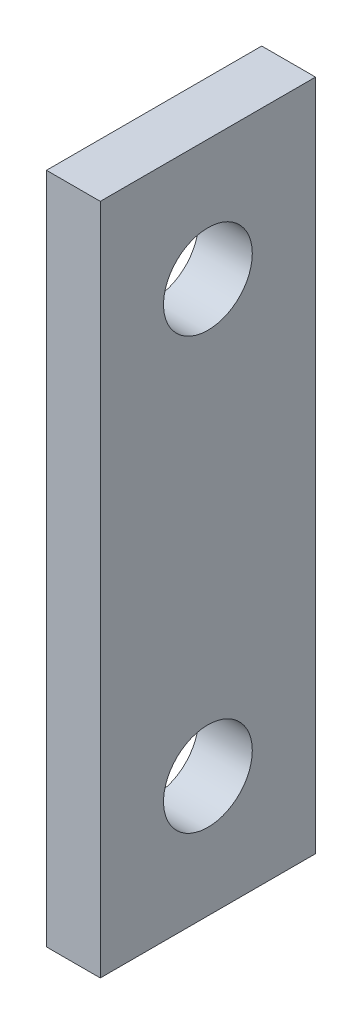
ISO-10303-21;
HEADER;
FILE_DESCRIPTION(('STEP AP214'),'2;1');
FILE_NAME('part.step','',(''),(''),'','','');
FILE_SCHEMA(('AUTOMOTIVE_DESIGN { 1 0 10303 214 1 1 1 1 }'));
ENDSEC;
DATA;
#1=APPLICATION_CONTEXT('core data for automotive mechanical design processes');
#2=APPLICATION_PROTOCOL_DEFINITION('international standard','automotive_design',2000,#1);
#3=PRODUCT_CONTEXT('',#1,'mechanical');
#4=PRODUCT('Part','Part','',(#3));
#5=PRODUCT_RELATED_PRODUCT_CATEGORY('part','',(#4));
#6=PRODUCT_DEFINITION_FORMATION('','',#4);
#7=PRODUCT_DEFINITION_CONTEXT('part definition',#1,'design');
#8=PRODUCT_DEFINITION('design','',#6,#7);
#9=PRODUCT_DEFINITION_SHAPE('','',#8);
#10=(LENGTH_UNIT() NAMED_UNIT(*) SI_UNIT(.MILLI.,.METRE.));
#11=(NAMED_UNIT(*) PLANE_ANGLE_UNIT() SI_UNIT($,.RADIAN.));
#12=(NAMED_UNIT(*) SI_UNIT($,.STERADIAN.) SOLID_ANGLE_UNIT());
#13=UNCERTAINTY_MEASURE_WITH_UNIT(LENGTH_MEASURE(1.E-05),#10,'distance_accuracy_value','');
#14=(GEOMETRIC_REPRESENTATION_CONTEXT(3) GLOBAL_UNCERTAINTY_ASSIGNED_CONTEXT((#13)) GLOBAL_UNIT_ASSIGNED_CONTEXT((#10,
#11,#12)) REPRESENTATION_CONTEXT('',''));
#15=CARTESIAN_POINT('',(0.,0.,0.));
#16=DIRECTION('',(0.,0.,1.));
#17=DIRECTION('',(1.,0.,0.));
#18=AXIS2_PLACEMENT_3D('',#15,#16,#17);
#19=CARTESIAN_POINT('',(5.,0.,0.));
#20=DIRECTION('',(1.,0.,0.));
#21=DIRECTION('',(0.,0.,-1.));
#22=AXIS2_PLACEMENT_3D('',#19,#20,#21);
#23=PLANE('',#22);
#24=CARTESIAN_POINT('',(5.,-40.,0.));
#25=DIRECTION('',(1.,0.,0.));
#26=DIRECTION('',(0.,0.,-1.));
#27=AXIS2_PLACEMENT_3D('',#24,#25,#26);
#28=CIRCLE('',#27,8.25);
#29=CARTESIAN_POINT('',(5.,-40.,-8.25));
#30=VERTEX_POINT('',#29);
#31=EDGE_CURVE('E106',#30,#30,#28,.T.);
#32=ORIENTED_EDGE('',*,*,#31,.F.);
#33=EDGE_LOOP('',(#32));
#34=FACE_BOUND('',#33,.T.);
#35=DIRECTION('',(0.,0.,1.));
#36=VECTOR('',#35,1.);
#37=CARTESIAN_POINT('',(5.,62.5,20.));
#38=LINE('',#37,#36);
#39=CARTESIAN_POINT('',(5.,62.5,-20.));
#40=VERTEX_POINT('',#39);
#41=CARTESIAN_POINT('',(5.,62.5,20.));
#42=VERTEX_POINT('',#41);
#43=EDGE_CURVE('E91',#40,#42,#38,.T.);
#44=ORIENTED_EDGE('',*,*,#43,.T.);
#45=DIRECTION('',(0.,-1.,0.));
#46=VECTOR('',#45,1.);
#47=CARTESIAN_POINT('',(5.,-62.5,20.));
#48=LINE('',#47,#46);
#49=CARTESIAN_POINT('',(5.,-62.5,20.));
#50=VERTEX_POINT('',#49);
#51=EDGE_CURVE('E86',#42,#50,#48,.T.);
#52=ORIENTED_EDGE('',*,*,#51,.T.);
#53=DIRECTION('',(0.,0.,-1.));
#54=VECTOR('',#53,1.);
#55=CARTESIAN_POINT('',(5.,-62.5,20.));
#56=LINE('',#55,#54);
#57=CARTESIAN_POINT('',(5.,-62.5,-20.));
#58=VERTEX_POINT('',#57);
#59=EDGE_CURVE('E89',#50,#58,#56,.T.);
#60=ORIENTED_EDGE('',*,*,#59,.T.);
#61=DIRECTION('',(0.,1.,0.));
#62=VECTOR('',#61,1.);
#63=CARTESIAN_POINT('',(5.,-62.5,-20.));
#64=LINE('',#63,#62);
#65=EDGE_CURVE('E56',#58,#40,#64,.T.);
#66=ORIENTED_EDGE('',*,*,#65,.T.);
#67=EDGE_LOOP('',(#44,#52,#60,#66));
#68=FACE_BOUND('',#67,.T.);
#69=CARTESIAN_POINT('',(5.,40.,0.));
#70=DIRECTION('',(1.,0.,0.));
#71=DIRECTION('',(0.,0.,-1.));
#72=AXIS2_PLACEMENT_3D('',#69,#70,#71);
#73=CIRCLE('',#72,8.25);
#74=CARTESIAN_POINT('',(5.,40.,-8.25));
#75=VERTEX_POINT('',#74);
#76=EDGE_CURVE('E121',#75,#75,#73,.T.);
#77=ORIENTED_EDGE('',*,*,#76,.F.);
#78=EDGE_LOOP('',(#77));
#79=FACE_BOUND('',#78,.T.);
#80=ADVANCED_FACE('F39',(#34,#68,#79),#23,.T.);
#81=CARTESIAN_POINT('',(-5.,0.,0.));
#82=DIRECTION('',(1.,0.,0.));
#83=DIRECTION('',(0.,0.,-1.));
#84=AXIS2_PLACEMENT_3D('',#81,#82,#83);
#85=PLANE('',#84);
#86=DIRECTION('',(0.,0.,1.));
#87=VECTOR('',#86,1.);
#88=CARTESIAN_POINT('',(-5.,62.5,20.));
#89=LINE('',#88,#87);
#90=CARTESIAN_POINT('',(-5.,62.5,-20.));
#91=VERTEX_POINT('',#90);
#92=CARTESIAN_POINT('',(-5.,62.5,20.));
#93=VERTEX_POINT('',#92);
#94=EDGE_CURVE('E103',#91,#93,#89,.T.);
#95=ORIENTED_EDGE('',*,*,#94,.F.);
#96=DIRECTION('',(0.,1.,0.));
#97=VECTOR('',#96,1.);
#98=CARTESIAN_POINT('',(-5.,-62.5,-20.));
#99=LINE('',#98,#97);
#100=CARTESIAN_POINT('',(-5.,-62.5,-20.));
#101=VERTEX_POINT('',#100);
#102=EDGE_CURVE('E79',#101,#91,#99,.T.);
#103=ORIENTED_EDGE('',*,*,#102,.F.);
#104=DIRECTION('',(0.,0.,-1.));
#105=VECTOR('',#104,1.);
#106=CARTESIAN_POINT('',(-5.,-62.5,20.));
#107=LINE('',#106,#105);
#108=CARTESIAN_POINT('',(-5.,-62.5,20.));
#109=VERTEX_POINT('',#108);
#110=EDGE_CURVE('E73',#109,#101,#107,.T.);
#111=ORIENTED_EDGE('',*,*,#110,.F.);
#112=DIRECTION('',(0.,-1.,0.));
#113=VECTOR('',#112,1.);
#114=CARTESIAN_POINT('',(-5.,-62.5,20.));
#115=LINE('',#114,#113);
#116=EDGE_CURVE('E95',#93,#109,#115,.T.);
#117=ORIENTED_EDGE('',*,*,#116,.F.);
#118=EDGE_LOOP('',(#95,#103,#111,#117));
#119=FACE_BOUND('',#118,.T.);
#120=CARTESIAN_POINT('',(-5.,-40.,0.));
#121=DIRECTION('',(1.,0.,0.));
#122=DIRECTION('',(0.,0.,-1.));
#123=AXIS2_PLACEMENT_3D('',#120,#121,#122);
#124=CIRCLE('',#123,8.25);
#125=CARTESIAN_POINT('',(-5.,-40.,-8.25));
#126=VERTEX_POINT('',#125);
#127=EDGE_CURVE('E118',#126,#126,#124,.T.);
#128=ORIENTED_EDGE('',*,*,#127,.T.);
#129=EDGE_LOOP('',(#128));
#130=FACE_BOUND('',#129,.T.);
#131=CARTESIAN_POINT('',(-5.,40.,0.));
#132=DIRECTION('',(1.,0.,0.));
#133=DIRECTION('',(0.,0.,-1.));
#134=AXIS2_PLACEMENT_3D('',#131,#132,#133);
#135=CIRCLE('',#134,8.25);
#136=CARTESIAN_POINT('',(-5.,40.,-8.25));
#137=VERTEX_POINT('',#136);
#138=EDGE_CURVE('E124',#137,#137,#135,.T.);
#139=ORIENTED_EDGE('',*,*,#138,.T.);
#140=EDGE_LOOP('',(#139));
#141=FACE_BOUND('',#140,.T.);
#142=ADVANCED_FACE('F114',(#119,#130,#141),#85,.F.);
#143=CARTESIAN_POINT('',(5.,62.5,20.));
#144=DIRECTION('',(0.,-1.,0.));
#145=DIRECTION('',(0.,0.,-1.));
#146=AXIS2_PLACEMENT_3D('',#143,#144,#145);
#147=PLANE('',#146);
#148=ORIENTED_EDGE('',*,*,#94,.T.);
#149=DIRECTION('',(-1.,0.,0.));
#150=VECTOR('',#149,1.);
#151=CARTESIAN_POINT('',(5.,62.5,20.));
#152=LINE('',#151,#150);
#153=EDGE_CURVE('E11',#42,#93,#152,.T.);
#154=ORIENTED_EDGE('',*,*,#153,.F.);
#155=ORIENTED_EDGE('',*,*,#43,.F.);
#156=DIRECTION('',(-1.,0.,0.));
#157=VECTOR('',#156,1.);
#158=CARTESIAN_POINT('',(5.,62.5,-20.));
#159=LINE('',#158,#157);
#160=EDGE_CURVE('E99',#40,#91,#159,.T.);
#161=ORIENTED_EDGE('',*,*,#160,.T.);
#162=EDGE_LOOP('',(#148,#154,#155,#161));
#163=FACE_BOUND('',#162,.T.);
#164=ADVANCED_FACE('F41',(#163),#147,.F.);
#165=CARTESIAN_POINT('',(5.,-62.5,20.));
#166=DIRECTION('',(0.,0.,-1.));
#167=DIRECTION('',(0.,1.,0.));
#168=AXIS2_PLACEMENT_3D('',#165,#166,#167);
#169=PLANE('',#168);
#170=ORIENTED_EDGE('',*,*,#116,.T.);
#171=DIRECTION('',(-1.,0.,0.));
#172=VECTOR('',#171,1.);
#173=CARTESIAN_POINT('',(5.,-62.5,20.));
#174=LINE('',#173,#172);
#175=EDGE_CURVE('E48',#50,#109,#174,.T.);
#176=ORIENTED_EDGE('',*,*,#175,.F.);
#177=ORIENTED_EDGE('',*,*,#51,.F.);
#178=ORIENTED_EDGE('',*,*,#153,.T.);
#179=EDGE_LOOP('',(#170,#176,#177,#178));
#180=FACE_BOUND('',#179,.T.);
#181=ADVANCED_FACE('F94',(#180),#169,.F.);
#182=CARTESIAN_POINT('',(5.,-62.5,20.));
#183=DIRECTION('',(0.,1.,0.));
#184=DIRECTION('',(0.,0.,1.));
#185=AXIS2_PLACEMENT_3D('',#182,#183,#184);
#186=PLANE('',#185);
#187=ORIENTED_EDGE('',*,*,#110,.T.);
#188=DIRECTION('',(-1.,0.,0.));
#189=VECTOR('',#188,1.);
#190=CARTESIAN_POINT('',(5.,-62.5,-20.));
#191=LINE('',#190,#189);
#192=EDGE_CURVE('E96',#58,#101,#191,.T.);
#193=ORIENTED_EDGE('',*,*,#192,.F.);
#194=ORIENTED_EDGE('',*,*,#59,.F.);
#195=ORIENTED_EDGE('',*,*,#175,.T.);
#196=EDGE_LOOP('',(#187,#193,#194,#195));
#197=FACE_BOUND('',#196,.T.);
#198=ADVANCED_FACE('F97',(#197),#186,.F.);
#199=CARTESIAN_POINT('',(5.,-62.5,-20.));
#200=DIRECTION('',(0.,0.,1.));
#201=DIRECTION('',(1.,0.,0.));
#202=AXIS2_PLACEMENT_3D('',#199,#200,#201);
#203=PLANE('',#202);
#204=ORIENTED_EDGE('',*,*,#102,.T.);
#205=ORIENTED_EDGE('',*,*,#160,.F.);
#206=ORIENTED_EDGE('',*,*,#65,.F.);
#207=ORIENTED_EDGE('',*,*,#192,.T.);
#208=EDGE_LOOP('',(#204,#205,#206,#207));
#209=FACE_BOUND('',#208,.T.);
#210=ADVANCED_FACE('F111',(#209),#203,.F.);
#211=CARTESIAN_POINT('',(5.,-40.,0.));
#212=DIRECTION('',(-1.,0.,0.));
#213=DIRECTION('',(0.,0.,1.));
#214=AXIS2_PLACEMENT_3D('',#211,#212,#213);
#215=CYLINDRICAL_SURFACE('',#214,8.25);
#216=ORIENTED_EDGE('',*,*,#31,.T.);
#217=EDGE_LOOP('',(#216));
#218=FACE_BOUND('',#217,.T.);
#219=ORIENTED_EDGE('',*,*,#127,.F.);
#220=EDGE_LOOP('',(#219));
#221=FACE_BOUND('',#220,.T.);
#222=ADVANCED_FACE('F141',(#218,#221),#215,.F.);
#223=CARTESIAN_POINT('',(5.,40.,0.));
#224=DIRECTION('',(-1.,0.,0.));
#225=DIRECTION('',(0.,0.,1.));
#226=AXIS2_PLACEMENT_3D('',#223,#224,#225);
#227=CYLINDRICAL_SURFACE('',#226,8.25);
#228=ORIENTED_EDGE('',*,*,#76,.T.);
#229=EDGE_LOOP('',(#228));
#230=FACE_BOUND('',#229,.T.);
#231=ORIENTED_EDGE('',*,*,#138,.F.);
#232=EDGE_LOOP('',(#231));
#233=FACE_BOUND('',#232,.T.);
#234=ADVANCED_FACE('F130',(#230,#233),#227,.F.);
#235=CLOSED_SHELL('',(#80,#142,#164,#181,#198,#210,#222,#234));
#236=MANIFOLD_SOLID_BREP('B2',#235);
#237=ADVANCED_BREP_SHAPE_REPRESENTATION('',(#18,#236),#14);
#238=SHAPE_DEFINITION_REPRESENTATION(#9,#237);
ENDSEC;
END-ISO-10303-21;
